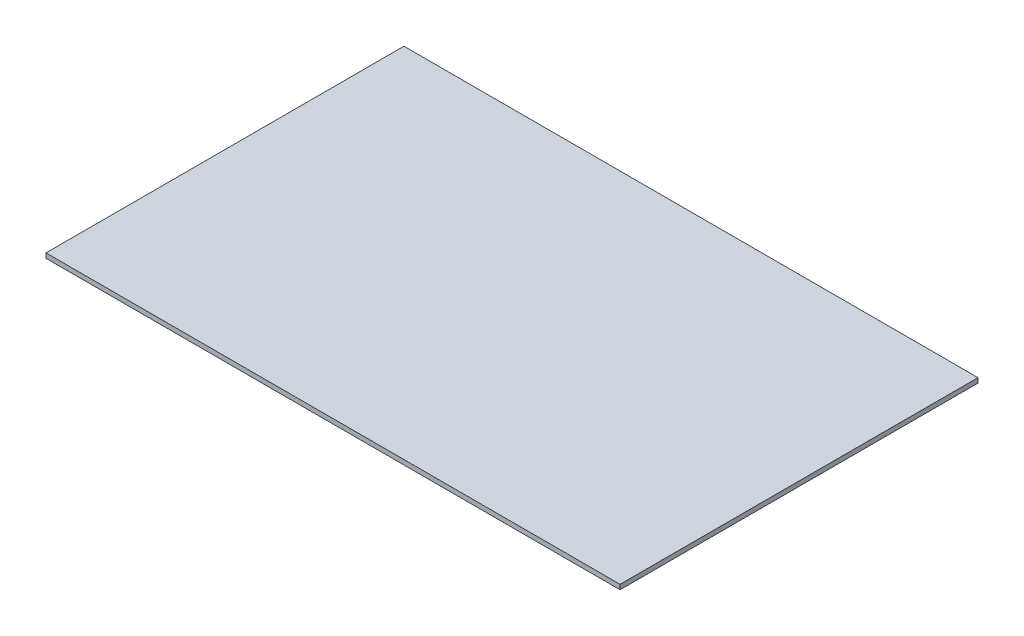
ISO-10303-21;
HEADER;
FILE_DESCRIPTION(('STEP AP214'),'2;1');
FILE_NAME('part.step','',(''),(''),'','','');
FILE_SCHEMA(('AUTOMOTIVE_DESIGN { 1 0 10303 214 1 1 1 1 }'));
ENDSEC;
DATA;
#1=APPLICATION_CONTEXT('core data for automotive mechanical design processes');
#2=APPLICATION_PROTOCOL_DEFINITION('international standard','automotive_design',2000,#1);
#3=PRODUCT_CONTEXT('',#1,'mechanical');
#4=PRODUCT('Part','Part','',(#3));
#5=PRODUCT_RELATED_PRODUCT_CATEGORY('part','',(#4));
#6=PRODUCT_DEFINITION_FORMATION('','',#4);
#7=PRODUCT_DEFINITION_CONTEXT('part definition',#1,'design');
#8=PRODUCT_DEFINITION('design','',#6,#7);
#9=PRODUCT_DEFINITION_SHAPE('','',#8);
#10=(LENGTH_UNIT() NAMED_UNIT(*) SI_UNIT(.MILLI.,.METRE.));
#11=(NAMED_UNIT(*) PLANE_ANGLE_UNIT() SI_UNIT($,.RADIAN.));
#12=(NAMED_UNIT(*) SI_UNIT($,.STERADIAN.) SOLID_ANGLE_UNIT());
#13=UNCERTAINTY_MEASURE_WITH_UNIT(LENGTH_MEASURE(1.E-05),#10,'distance_accuracy_value','');
#14=(GEOMETRIC_REPRESENTATION_CONTEXT(3) GLOBAL_UNCERTAINTY_ASSIGNED_CONTEXT((#13)) GLOBAL_UNIT_ASSIGNED_CONTEXT((#10,
#11,#12)) REPRESENTATION_CONTEXT('',''));
#15=CARTESIAN_POINT('',(0.,0.,0.));
#16=DIRECTION('',(0.,0.,1.));
#17=DIRECTION('',(1.,0.,0.));
#18=AXIS2_PLACEMENT_3D('',#15,#16,#17);
#19=CARTESIAN_POINT('',(-46.4304477740492,0.7,-28.1666666666667));
#20=DIRECTION('',(1.,0.,0.));
#21=DIRECTION('',(0.,0.,-1.));
#22=AXIS2_PLACEMENT_3D('',#19,#20,#21);
#23=PLANE('',#22);
#24=DIRECTION('',(0.,0.,1.));
#25=VECTOR('',#24,1.);
#26=CARTESIAN_POINT('',(-46.4304477740492,0.,-28.1666666666667));
#27=LINE('',#26,#25);
#28=CARTESIAN_POINT('',(-46.4304477740492,0.,-28.1666666666667));
#29=VERTEX_POINT('',#28);
#30=CARTESIAN_POINT('',(-46.4304477740492,0.,24.8333333333333));
#31=VERTEX_POINT('',#30);
#32=EDGE_CURVE('E96',#29,#31,#27,.T.);
#33=ORIENTED_EDGE('',*,*,#32,.T.);
#34=DIRECTION('',(0.,-1.,0.));
#35=VECTOR('',#34,1.);
#36=CARTESIAN_POINT('',(-46.4304477740492,0.7,24.8333333333333));
#37=LINE('',#36,#35);
#38=CARTESIAN_POINT('',(-46.4304477740492,0.7,24.8333333333333));
#39=VERTEX_POINT('',#38);
#40=EDGE_CURVE('E11',#39,#31,#37,.T.);
#41=ORIENTED_EDGE('',*,*,#40,.F.);
#42=DIRECTION('',(0.,0.,1.));
#43=VECTOR('',#42,1.);
#44=CARTESIAN_POINT('',(-46.4304477740492,0.7,-28.1666666666667));
#45=LINE('',#44,#43);
#46=CARTESIAN_POINT('',(-46.4304477740492,0.7,-28.1666666666667));
#47=VERTEX_POINT('',#46);
#48=EDGE_CURVE('E84',#47,#39,#45,.T.);
#49=ORIENTED_EDGE('',*,*,#48,.F.);
#50=DIRECTION('',(0.,-1.,0.));
#51=VECTOR('',#50,1.);
#52=CARTESIAN_POINT('',(-46.4304477740492,0.7,-28.1666666666667));
#53=LINE('',#52,#51);
#54=EDGE_CURVE('E92',#47,#29,#53,.T.);
#55=ORIENTED_EDGE('',*,*,#54,.T.);
#56=EDGE_LOOP('',(#33,#41,#49,#55));
#57=FACE_BOUND('',#56,.T.);
#58=ADVANCED_FACE('F33',(#57),#23,.F.);
#59=CARTESIAN_POINT('',(-46.4304477740492,0.7,24.8333333333333));
#60=DIRECTION('',(0.,0.,-1.));
#61=DIRECTION('',(-1.,0.,0.));
#62=AXIS2_PLACEMENT_3D('',#59,#60,#61);
#63=PLANE('',#62);
#64=DIRECTION('',(1.,0.,0.));
#65=VECTOR('',#64,1.);
#66=CARTESIAN_POINT('',(-46.4304477740492,0.,24.8333333333333));
#67=LINE('',#66,#65);
#68=CARTESIAN_POINT('',(38.5695522259508,0.,24.8333333333333));
#69=VERTEX_POINT('',#68);
#70=EDGE_CURVE('E88',#31,#69,#67,.T.);
#71=ORIENTED_EDGE('',*,*,#70,.T.);
#72=DIRECTION('',(0.,-1.,0.));
#73=VECTOR('',#72,1.);
#74=CARTESIAN_POINT('',(38.5695522259508,0.7,24.8333333333333));
#75=LINE('',#74,#73);
#76=CARTESIAN_POINT('',(38.5695522259508,0.7,24.8333333333333));
#77=VERTEX_POINT('',#76);
#78=EDGE_CURVE('E41',#77,#69,#75,.T.);
#79=ORIENTED_EDGE('',*,*,#78,.F.);
#80=DIRECTION('',(1.,0.,0.));
#81=VECTOR('',#80,1.);
#82=CARTESIAN_POINT('',(-46.4304477740492,0.7,24.8333333333333));
#83=LINE('',#82,#81);
#84=EDGE_CURVE('E79',#39,#77,#83,.T.);
#85=ORIENTED_EDGE('',*,*,#84,.F.);
#86=ORIENTED_EDGE('',*,*,#40,.T.);
#87=EDGE_LOOP('',(#71,#79,#85,#86));
#88=FACE_BOUND('',#87,.T.);
#89=ADVANCED_FACE('F87',(#88),#63,.F.);
#90=CARTESIAN_POINT('',(38.5695522259508,0.7,-28.1666666666667));
#91=DIRECTION('',(-1.,0.,0.));
#92=DIRECTION('',(0.,0.,1.));
#93=AXIS2_PLACEMENT_3D('',#90,#91,#92);
#94=PLANE('',#93);
#95=DIRECTION('',(0.,0.,-1.));
#96=VECTOR('',#95,1.);
#97=CARTESIAN_POINT('',(38.5695522259508,0.,-28.1666666666667));
#98=LINE('',#97,#96);
#99=CARTESIAN_POINT('',(38.5695522259508,0.,-28.1666666666667));
#100=VERTEX_POINT('',#99);
#101=EDGE_CURVE('E66',#69,#100,#98,.T.);
#102=ORIENTED_EDGE('',*,*,#101,.T.);
#103=DIRECTION('',(0.,-1.,0.));
#104=VECTOR('',#103,1.);
#105=CARTESIAN_POINT('',(38.5695522259508,0.7,-28.1666666666667));
#106=LINE('',#105,#104);
#107=CARTESIAN_POINT('',(38.5695522259508,0.7,-28.1666666666667));
#108=VERTEX_POINT('',#107);
#109=EDGE_CURVE('E89',#108,#100,#106,.T.);
#110=ORIENTED_EDGE('',*,*,#109,.F.);
#111=DIRECTION('',(0.,0.,-1.));
#112=VECTOR('',#111,1.);
#113=CARTESIAN_POINT('',(38.5695522259508,0.7,-28.1666666666667));
#114=LINE('',#113,#112);
#115=EDGE_CURVE('E82',#77,#108,#114,.T.);
#116=ORIENTED_EDGE('',*,*,#115,.F.);
#117=ORIENTED_EDGE('',*,*,#78,.T.);
#118=EDGE_LOOP('',(#102,#110,#116,#117));
#119=FACE_BOUND('',#118,.T.);
#120=ADVANCED_FACE('F90',(#119),#94,.F.);
#121=CARTESIAN_POINT('',(-46.4304477740492,0.7,-28.1666666666667));
#122=DIRECTION('',(0.,0.,1.));
#123=DIRECTION('',(1.,0.,0.));
#124=AXIS2_PLACEMENT_3D('',#121,#122,#123);
#125=PLANE('',#124);
#126=DIRECTION('',(-1.,0.,0.));
#127=VECTOR('',#126,1.);
#128=CARTESIAN_POINT('',(-46.4304477740492,0.,-28.1666666666667));
#129=LINE('',#128,#127);
#130=EDGE_CURVE('E72',#100,#29,#129,.T.);
#131=ORIENTED_EDGE('',*,*,#130,.T.);
#132=ORIENTED_EDGE('',*,*,#54,.F.);
#133=DIRECTION('',(-1.,0.,0.));
#134=VECTOR('',#133,1.);
#135=CARTESIAN_POINT('',(-46.4304477740492,0.7,-28.1666666666667));
#136=LINE('',#135,#134);
#137=EDGE_CURVE('E49',#108,#47,#136,.T.);
#138=ORIENTED_EDGE('',*,*,#137,.F.);
#139=ORIENTED_EDGE('',*,*,#109,.T.);
#140=EDGE_LOOP('',(#131,#132,#138,#139));
#141=FACE_BOUND('',#140,.T.);
#142=ADVANCED_FACE('F103',(#141),#125,.F.);
#143=CARTESIAN_POINT('',(0.,0.7,0.));
#144=DIRECTION('',(0.,1.,0.));
#145=DIRECTION('',(0.,0.,1.));
#146=AXIS2_PLACEMENT_3D('',#143,#144,#145);
#147=PLANE('',#146);
#148=ORIENTED_EDGE('',*,*,#48,.T.);
#149=ORIENTED_EDGE('',*,*,#84,.T.);
#150=ORIENTED_EDGE('',*,*,#115,.T.);
#151=ORIENTED_EDGE('',*,*,#137,.T.);
#152=EDGE_LOOP('',(#148,#149,#150,#151));
#153=FACE_BOUND('',#152,.T.);
#154=ADVANCED_FACE('F80',(#153),#147,.T.);
#155=CARTESIAN_POINT('',(0.,0.,0.));
#156=DIRECTION('',(0.,1.,0.));
#157=DIRECTION('',(0.,0.,1.));
#158=AXIS2_PLACEMENT_3D('',#155,#156,#157);
#159=PLANE('',#158);
#160=ORIENTED_EDGE('',*,*,#32,.F.);
#161=ORIENTED_EDGE('',*,*,#130,.F.);
#162=ORIENTED_EDGE('',*,*,#101,.F.);
#163=ORIENTED_EDGE('',*,*,#70,.F.);
#164=EDGE_LOOP('',(#160,#161,#162,#163));
#165=FACE_BOUND('',#164,.T.);
#166=ADVANCED_FACE('F106',(#165),#159,.F.);
#167=CLOSED_SHELL('',(#58,#89,#120,#142,#154,#166));
#168=MANIFOLD_SOLID_BREP('B2',#167);
#169=ADVANCED_BREP_SHAPE_REPRESENTATION('',(#18,#168),#14);
#170=SHAPE_DEFINITION_REPRESENTATION(#9,#169);
ENDSEC;
END-ISO-10303-21;
